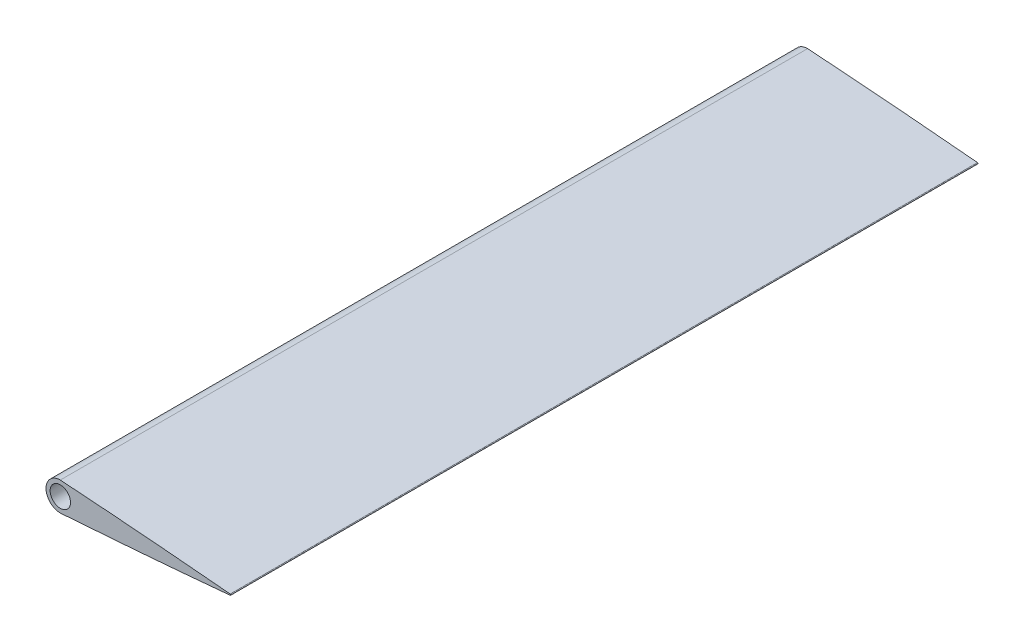
ISO-10303-21;
HEADER;
FILE_DESCRIPTION(('STEP AP214'),'2;1');
FILE_NAME('part.step','',(''),(''),'','','');
FILE_SCHEMA(('AUTOMOTIVE_DESIGN { 1 0 10303 214 1 1 1 1 }'));
ENDSEC;
DATA;
#1=APPLICATION_CONTEXT('core data for automotive mechanical design processes');
#2=APPLICATION_PROTOCOL_DEFINITION('international standard','automotive_design',2000,#1);
#3=PRODUCT_CONTEXT('',#1,'mechanical');
#4=PRODUCT('Part','Part','',(#3));
#5=PRODUCT_RELATED_PRODUCT_CATEGORY('part','',(#4));
#6=PRODUCT_DEFINITION_FORMATION('','',#4);
#7=PRODUCT_DEFINITION_CONTEXT('part definition',#1,'design');
#8=PRODUCT_DEFINITION('design','',#6,#7);
#9=PRODUCT_DEFINITION_SHAPE('','',#8);
#10=(LENGTH_UNIT() NAMED_UNIT(*) SI_UNIT(.MILLI.,.METRE.));
#11=(NAMED_UNIT(*) PLANE_ANGLE_UNIT() SI_UNIT($,.RADIAN.));
#12=(NAMED_UNIT(*) SI_UNIT($,.STERADIAN.) SOLID_ANGLE_UNIT());
#13=UNCERTAINTY_MEASURE_WITH_UNIT(LENGTH_MEASURE(1.E-05),#10,'distance_accuracy_value','');
#14=(GEOMETRIC_REPRESENTATION_CONTEXT(3) GLOBAL_UNCERTAINTY_ASSIGNED_CONTEXT((#13)) GLOBAL_UNIT_ASSIGNED_CONTEXT((#10,
#11,#12)) REPRESENTATION_CONTEXT('',''));
#15=CARTESIAN_POINT('',(0.,0.,0.));
#16=DIRECTION('',(0.,0.,1.));
#17=DIRECTION('',(1.,0.,0.));
#18=AXIS2_PLACEMENT_3D('',#15,#16,#17);
#19=CARTESIAN_POINT('',(75.,0.,110.));
#20=DIRECTION('',(0.,0.,-1.));
#21=DIRECTION('',(-1.,0.,0.));
#22=AXIS2_PLACEMENT_3D('',#19,#20,#21);
#23=CYLINDRICAL_SURFACE('',#22,2.10721605541312);
#24=CARTESIAN_POINT('',(75.,0.,0.));
#25=DIRECTION('',(0.,0.,1.));
#26=DIRECTION('',(1.,0.,0.));
#27=AXIS2_PLACEMENT_3D('',#24,#25,#26);
#28=CIRCLE('',#27,2.10721605541312);
#29=CARTESIAN_POINT('',(75.,2.10721605541312,0.));
#30=VERTEX_POINT('',#29);
#31=CARTESIAN_POINT('',(75.,-2.10721605541312,0.));
#32=VERTEX_POINT('',#31);
#33=EDGE_CURVE('E104',#30,#32,#28,.T.);
#34=ORIENTED_EDGE('',*,*,#33,.T.);
#35=DIRECTION('',(0.,0.,-1.));
#36=VECTOR('',#35,1.);
#37=CARTESIAN_POINT('',(75.,-2.10721605541312,110.));
#38=LINE('',#37,#36);
#39=CARTESIAN_POINT('',(75.,-2.10721605541312,110.));
#40=VERTEX_POINT('',#39);
#41=EDGE_CURVE('E11',#40,#32,#38,.T.);
#42=ORIENTED_EDGE('',*,*,#41,.F.);
#43=CARTESIAN_POINT('',(75.,0.,110.));
#44=DIRECTION('',(0.,0.,1.));
#45=DIRECTION('',(1.,0.,0.));
#46=AXIS2_PLACEMENT_3D('',#43,#44,#45);
#47=CIRCLE('',#46,2.10721605541312);
#48=CARTESIAN_POINT('',(75.,2.10721605541312,110.));
#49=VERTEX_POINT('',#48);
#50=EDGE_CURVE('E83',#49,#40,#47,.T.);
#51=ORIENTED_EDGE('',*,*,#50,.F.);
#52=DIRECTION('',(0.,0.,-1.));
#53=VECTOR('',#52,1.);
#54=CARTESIAN_POINT('',(75.,2.10721605541312,110.));
#55=LINE('',#54,#53);
#56=EDGE_CURVE('E94',#49,#30,#55,.T.);
#57=ORIENTED_EDGE('',*,*,#56,.T.);
#58=EDGE_LOOP('',(#34,#42,#51,#57));
#59=FACE_BOUND('',#58,.T.);
#60=ADVANCED_FACE('F36',(#59),#23,.T.);
#61=CARTESIAN_POINT('',(74.999999999998,-2.10721605541329,110.));
#62=CARTESIAN_POINT('',(76.6669297576925,-1.9915226947353,110.));
#63=CARTESIAN_POINT('',(81.6686314085558,-1.63315595196956,110.));
#64=CARTESIAN_POINT('',(88.3355596211878,-1.11089898015663,110.));
#65=CARTESIAN_POINT('',(95.0011947254254,-0.542172688557612,110.));
#66=CARTESIAN_POINT('',(98.333488814933,-0.236746480055367,110.));
#67=CARTESIAN_POINT('',(100.,-0.0840000000000019,110.));
#68=B_SPLINE_CURVE_WITH_KNOTS('',3,(#61,#62,#63,#64,#65,#66,#67),.UNSPECIFIED.,.F.,.F.,(4,1,1,1,
4),(0.875718334299025,0.900556597888905,0.9502582853295,0.975123707081014,1.),.UNSPECIFIED.);
#69=DIRECTION('',(0.,0.,-1.));
#70=VECTOR('',#69,1.);
#71=SURFACE_OF_LINEAR_EXTRUSION('',#68,#70);
#72=CARTESIAN_POINT('',(74.999999999998,-2.10721605541329,0.));
#73=CARTESIAN_POINT('',(76.6669297576925,-1.9915226947353,0.));
#74=CARTESIAN_POINT('',(81.6686314085558,-1.63315595196956,0.));
#75=CARTESIAN_POINT('',(88.3355596211878,-1.11089898015663,0.));
#76=CARTESIAN_POINT('',(95.0011947254254,-0.542172688557612,0.));
#77=CARTESIAN_POINT('',(98.333488814933,-0.236746480055367,0.));
#78=CARTESIAN_POINT('',(100.,-0.0840000000000019,0.));
#79=B_SPLINE_CURVE_WITH_KNOTS('',3,(#72,#73,#74,#75,#76,#77,#78),.UNSPECIFIED.,.F.,.F.,(4,1,1,1,
4),(0.875718334299025,0.900556597888905,0.9502582853295,0.975123707081014,1.),.UNSPECIFIED.);
#80=CARTESIAN_POINT('',(100.000000000002,-0.0839999999999882,0.));
#81=VERTEX_POINT('',#80);
#82=EDGE_CURVE('E88',#32,#81,#79,.T.);
#83=ORIENTED_EDGE('',*,*,#82,.T.);
#84=DIRECTION('',(0.,0.,-1.));
#85=VECTOR('',#84,1.);
#86=CARTESIAN_POINT('',(100.000000000002,-0.0839999999999882,110.));
#87=LINE('',#86,#85);
#88=CARTESIAN_POINT('',(100.000000000002,-0.0839999999999882,110.));
#89=VERTEX_POINT('',#88);
#90=EDGE_CURVE('E44',#89,#81,#87,.T.);
#91=ORIENTED_EDGE('',*,*,#90,.F.);
#92=EDGE_CURVE('E78',#40,#89,#68,.T.);
#93=ORIENTED_EDGE('',*,*,#92,.F.);
#94=ORIENTED_EDGE('',*,*,#41,.T.);
#95=EDGE_LOOP('',(#83,#91,#93,#94));
#96=FACE_BOUND('',#95,.T.);
#97=ADVANCED_FACE('F87',(#96),#71,.F.);
#98=CARTESIAN_POINT('',(100.,0.,110.));
#99=DIRECTION('',(0.,0.,-1.));
#100=DIRECTION('',(-1.,0.,0.));
#101=AXIS2_PLACEMENT_3D('',#98,#99,#100);
#102=CYLINDRICAL_SURFACE('',#101,0.0839999999999882);
#103=CARTESIAN_POINT('',(100.,0.,0.));
#104=DIRECTION('',(0.,0.,1.));
#105=DIRECTION('',(1.,0.,0.));
#106=AXIS2_PLACEMENT_3D('',#103,#104,#105);
#107=CIRCLE('',#106,0.0839999999999882);
#108=CARTESIAN_POINT('',(100.,0.0839999999999882,0.));
#109=VERTEX_POINT('',#108);
#110=EDGE_CURVE('E128',#109,#81,#107,.F.);
#111=ORIENTED_EDGE('',*,*,#110,.F.);
#112=DIRECTION('',(0.,0.,-1.));
#113=VECTOR('',#112,1.);
#114=CARTESIAN_POINT('',(100.,0.0839999999999882,110.));
#115=LINE('',#114,#113);
#116=CARTESIAN_POINT('',(100.,0.0839999999999882,110.));
#117=VERTEX_POINT('',#116);
#118=EDGE_CURVE('E68',#117,#109,#115,.T.);
#119=ORIENTED_EDGE('',*,*,#118,.F.);
#120=CARTESIAN_POINT('',(100.,0.,110.));
#121=DIRECTION('',(0.,0.,1.));
#122=DIRECTION('',(1.,0.,0.));
#123=AXIS2_PLACEMENT_3D('',#120,#121,#122);
#124=CIRCLE('',#123,0.0839999999999882);
#125=EDGE_CURVE('E81',#117,#89,#124,.F.);
#126=ORIENTED_EDGE('',*,*,#125,.T.);
#127=ORIENTED_EDGE('',*,*,#90,.T.);
#128=EDGE_LOOP('',(#111,#119,#126,#127));
#129=FACE_BOUND('',#128,.T.);
#130=ADVANCED_FACE('F92',(#129),#102,.T.);
#131=CARTESIAN_POINT('',(100.,0.084,110.));
#132=CARTESIAN_POINT('',(98.333488814933,0.236746480055364,110.));
#133=CARTESIAN_POINT('',(95.0011947254255,0.542172688557606,110.));
#134=CARTESIAN_POINT('',(88.3355596211879,1.11089898015662,110.));
#135=CARTESIAN_POINT('',(81.6686314085565,1.63315595196948,110.));
#136=CARTESIAN_POINT('',(76.6669297576939,1.99152269473518,110.));
#137=CARTESIAN_POINT('',(75.,2.10721605541312,110.));
#138=B_SPLINE_CURVE_WITH_KNOTS('',3,(#131,#132,#133,#134,#135,#136,#137),.UNSPECIFIED.,.F.,.F.,
(4,1,1,1,4),(0.,0.0248762929189861,0.0497417146704998,0.0994434021110951,0.124281665700965),.UNSPECIFIED.);
#139=DIRECTION('',(0.,0.,-1.));
#140=VECTOR('',#139,1.);
#141=SURFACE_OF_LINEAR_EXTRUSION('',#138,#140);
#142=CARTESIAN_POINT('',(100.,0.084,0.));
#143=CARTESIAN_POINT('',(98.333488814933,0.236746480055364,0.));
#144=CARTESIAN_POINT('',(95.0011947254255,0.542172688557606,0.));
#145=CARTESIAN_POINT('',(88.3355596211879,1.11089898015662,0.));
#146=CARTESIAN_POINT('',(81.6686314085565,1.63315595196948,0.));
#147=CARTESIAN_POINT('',(76.6669297576939,1.99152269473518,0.));
#148=CARTESIAN_POINT('',(75.,2.10721605541312,0.));
#149=B_SPLINE_CURVE_WITH_KNOTS('',3,(#142,#143,#144,#145,#146,#147,#148),.UNSPECIFIED.,.F.,.F.,
(4,1,1,1,4),(0.,0.0248762929189861,0.0497417146704998,0.0994434021110951,0.124281665700965),.UNSPECIFIED.);
#150=EDGE_CURVE('E71',#109,#30,#149,.T.);
#151=ORIENTED_EDGE('',*,*,#150,.T.);
#152=ORIENTED_EDGE('',*,*,#56,.F.);
#153=EDGE_CURVE('E52',#117,#49,#138,.T.);
#154=ORIENTED_EDGE('',*,*,#153,.F.);
#155=ORIENTED_EDGE('',*,*,#118,.T.);
#156=EDGE_LOOP('',(#151,#152,#154,#155));
#157=FACE_BOUND('',#156,.T.);
#158=ADVANCED_FACE('F110',(#157),#141,.F.);
#159=CARTESIAN_POINT('',(0.,0.,110.));
#160=DIRECTION('',(0.,0.,1.));
#161=DIRECTION('',(1.,0.,0.));
#162=AXIS2_PLACEMENT_3D('',#159,#160,#161);
#163=PLANE('',#162);
#164=CARTESIAN_POINT('',(75.,0.,110.));
#165=DIRECTION('',(0.,0.,1.));
#166=DIRECTION('',(1.,0.,0.));
#167=AXIS2_PLACEMENT_3D('',#164,#165,#166);
#168=CIRCLE('',#167,1.5);
#169=CARTESIAN_POINT('',(76.5,0.,110.));
#170=VERTEX_POINT('',#169);
#171=EDGE_CURVE('E130',#170,#170,#168,.T.);
#172=ORIENTED_EDGE('',*,*,#171,.F.);
#173=EDGE_LOOP('',(#172));
#174=FACE_BOUND('',#173,.T.);
#175=ORIENTED_EDGE('',*,*,#50,.T.);
#176=ORIENTED_EDGE('',*,*,#92,.T.);
#177=ORIENTED_EDGE('',*,*,#125,.F.);
#178=ORIENTED_EDGE('',*,*,#153,.T.);
#179=EDGE_LOOP('',(#175,#176,#177,#178));
#180=FACE_BOUND('',#179,.T.);
#181=ADVANCED_FACE('F79',(#174,#180),#163,.T.);
#182=CARTESIAN_POINT('',(0.,0.,0.));
#183=DIRECTION('',(0.,0.,1.));
#184=DIRECTION('',(1.,0.,0.));
#185=AXIS2_PLACEMENT_3D('',#182,#183,#184);
#186=PLANE('',#185);
#187=CARTESIAN_POINT('',(75.,0.,0.));
#188=DIRECTION('',(0.,0.,1.));
#189=DIRECTION('',(1.,0.,0.));
#190=AXIS2_PLACEMENT_3D('',#187,#188,#189);
#191=CIRCLE('',#190,1.5);
#192=CARTESIAN_POINT('',(76.5,0.,0.));
#193=VERTEX_POINT('',#192);
#194=EDGE_CURVE('E127',#193,#193,#191,.T.);
#195=ORIENTED_EDGE('',*,*,#194,.T.);
#196=EDGE_LOOP('',(#195));
#197=FACE_BOUND('',#196,.T.);
#198=ORIENTED_EDGE('',*,*,#33,.F.);
#199=ORIENTED_EDGE('',*,*,#150,.F.);
#200=ORIENTED_EDGE('',*,*,#110,.T.);
#201=ORIENTED_EDGE('',*,*,#82,.F.);
#202=EDGE_LOOP('',(#198,#199,#200,#201));
#203=FACE_BOUND('',#202,.T.);
#204=ADVANCED_FACE('F114',(#197,#203),#186,.F.);
#205=CARTESIAN_POINT('',(75.,0.,0.));
#206=DIRECTION('',(0.,0.,1.));
#207=DIRECTION('',(1.,0.,0.));
#208=AXIS2_PLACEMENT_3D('',#205,#206,#207);
#209=CYLINDRICAL_SURFACE('',#208,1.5);
#210=ORIENTED_EDGE('',*,*,#194,.F.);
#211=EDGE_LOOP('',(#210));
#212=FACE_BOUND('',#211,.T.);
#213=ORIENTED_EDGE('',*,*,#171,.T.);
#214=EDGE_LOOP('',(#213));
#215=FACE_BOUND('',#214,.T.);
#216=ADVANCED_FACE('F151',(#212,#215),#209,.F.);
#217=CLOSED_SHELL('',(#60,#97,#130,#158,#181,#204,#216));
#218=MANIFOLD_SOLID_BREP('B2',#217);
#219=ADVANCED_BREP_SHAPE_REPRESENTATION('',(#18,#218),#14);
#220=SHAPE_DEFINITION_REPRESENTATION(#9,#219);
ENDSEC;
END-ISO-10303-21;
